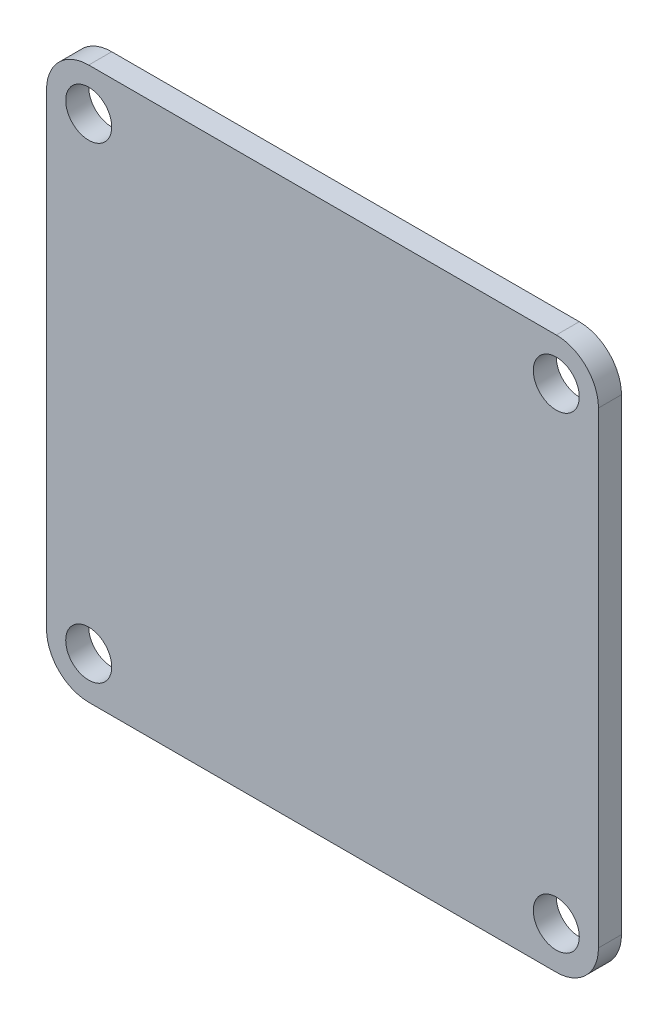
ISO-10303-21;
HEADER;
FILE_DESCRIPTION(('STEP AP214'),'2;1');
FILE_NAME('part.step','',(''),(''),'','','');
FILE_SCHEMA(('AUTOMOTIVE_DESIGN { 1 0 10303 214 1 1 1 1 }'));
ENDSEC;
DATA;
#1=APPLICATION_CONTEXT('core data for automotive mechanical design processes');
#2=APPLICATION_PROTOCOL_DEFINITION('international standard','automotive_design',2000,#1);
#3=PRODUCT_CONTEXT('',#1,'mechanical');
#4=PRODUCT('Part','Part','',(#3));
#5=PRODUCT_RELATED_PRODUCT_CATEGORY('part','',(#4));
#6=PRODUCT_DEFINITION_FORMATION('','',#4);
#7=PRODUCT_DEFINITION_CONTEXT('part definition',#1,'design');
#8=PRODUCT_DEFINITION('design','',#6,#7);
#9=PRODUCT_DEFINITION_SHAPE('','',#8);
#10=(LENGTH_UNIT() NAMED_UNIT(*) SI_UNIT(.MILLI.,.METRE.));
#11=(NAMED_UNIT(*) PLANE_ANGLE_UNIT() SI_UNIT($,.RADIAN.));
#12=(NAMED_UNIT(*) SI_UNIT($,.STERADIAN.) SOLID_ANGLE_UNIT());
#13=UNCERTAINTY_MEASURE_WITH_UNIT(LENGTH_MEASURE(1.E-05),#10,'distance_accuracy_value','');
#14=(GEOMETRIC_REPRESENTATION_CONTEXT(3) GLOBAL_UNCERTAINTY_ASSIGNED_CONTEXT((#13)) GLOBAL_UNIT_ASSIGNED_CONTEXT((#10,
#11,#12)) REPRESENTATION_CONTEXT('',''));
#15=CARTESIAN_POINT('',(0.,0.,0.));
#16=DIRECTION('',(0.,0.,1.));
#17=DIRECTION('',(1.,0.,0.));
#18=AXIS2_PLACEMENT_3D('',#15,#16,#17);
#19=CARTESIAN_POINT('',(-15.25,-15.25,1.5));
#20=DIRECTION('',(0.,0.,-1.));
#21=DIRECTION('',(-1.,0.,0.));
#22=AXIS2_PLACEMENT_3D('',#19,#20,#21);
#23=PLANE('',#22);
#24=CARTESIAN_POINT('',(-15.25,-15.25,1.5));
#25=DIRECTION('',(0.,0.,1.));
#26=DIRECTION('',(-1.,0.,0.));
#27=AXIS2_PLACEMENT_3D('',#24,#25,#26);
#28=CIRCLE('',#27,2.75);
#29=CARTESIAN_POINT('',(-18.,-15.25,1.5));
#30=VERTEX_POINT('',#29);
#31=CARTESIAN_POINT('',(-15.25,-18.,1.5));
#32=VERTEX_POINT('',#31);
#33=EDGE_CURVE('E151',#30,#32,#28,.T.);
#34=ORIENTED_EDGE('',*,*,#33,.T.);
#35=DIRECTION('',(1.,0.,0.));
#36=VECTOR('',#35,1.);
#37=CARTESIAN_POINT('',(-15.25,-18.,1.5));
#38=LINE('',#37,#36);
#39=CARTESIAN_POINT('',(15.25,-18.,1.5));
#40=VERTEX_POINT('',#39);
#41=EDGE_CURVE('E99',#32,#40,#38,.T.);
#42=ORIENTED_EDGE('',*,*,#41,.T.);
#43=CARTESIAN_POINT('',(15.25,-15.25,1.5));
#44=DIRECTION('',(0.,0.,1.));
#45=DIRECTION('',(1.,0.,0.));
#46=AXIS2_PLACEMENT_3D('',#43,#44,#45);
#47=CIRCLE('',#46,2.75);
#48=CARTESIAN_POINT('',(18.,-15.25,1.5));
#49=VERTEX_POINT('',#48);
#50=EDGE_CURVE('E166',#40,#49,#47,.T.);
#51=ORIENTED_EDGE('',*,*,#50,.T.);
#52=DIRECTION('',(0.,1.,0.));
#53=VECTOR('',#52,1.);
#54=CARTESIAN_POINT('',(18.,15.25,1.5));
#55=LINE('',#54,#53);
#56=CARTESIAN_POINT('',(18.,15.25,1.5));
#57=VERTEX_POINT('',#56);
#58=EDGE_CURVE('E179',#49,#57,#55,.T.);
#59=ORIENTED_EDGE('',*,*,#58,.T.);
#60=CARTESIAN_POINT('',(15.25,15.25,1.5));
#61=DIRECTION('',(0.,0.,1.));
#62=DIRECTION('',(1.,0.,0.));
#63=AXIS2_PLACEMENT_3D('',#60,#61,#62);
#64=CIRCLE('',#63,2.75);
#65=CARTESIAN_POINT('',(15.25,18.,1.5));
#66=VERTEX_POINT('',#65);
#67=EDGE_CURVE('E118',#57,#66,#64,.T.);
#68=ORIENTED_EDGE('',*,*,#67,.T.);
#69=DIRECTION('',(-1.,0.,0.));
#70=VECTOR('',#69,1.);
#71=CARTESIAN_POINT('',(-15.25,18.,1.5));
#72=LINE('',#71,#70);
#73=CARTESIAN_POINT('',(-15.25,18.,1.5));
#74=VERTEX_POINT('',#73);
#75=EDGE_CURVE('E112',#66,#74,#72,.T.);
#76=ORIENTED_EDGE('',*,*,#75,.T.);
#77=CARTESIAN_POINT('',(-15.25,15.25,1.5));
#78=DIRECTION('',(0.,0.,1.));
#79=DIRECTION('',(-1.,0.,0.));
#80=AXIS2_PLACEMENT_3D('',#77,#78,#79);
#81=CIRCLE('',#80,2.75);
#82=CARTESIAN_POINT('',(-18.,15.25,1.5));
#83=VERTEX_POINT('',#82);
#84=EDGE_CURVE('E116',#74,#83,#81,.T.);
#85=ORIENTED_EDGE('',*,*,#84,.T.);
#86=DIRECTION('',(0.,-1.,0.));
#87=VECTOR('',#86,1.);
#88=CARTESIAN_POINT('',(-18.,15.25,1.5));
#89=LINE('',#88,#87);
#90=EDGE_CURVE('E56',#83,#30,#89,.T.);
#91=ORIENTED_EDGE('',*,*,#90,.T.);
#92=EDGE_LOOP('',(#34,#42,#51,#59,#68,#76,#85,#91));
#93=FACE_BOUND('',#92,.T.);
#94=CARTESIAN_POINT('',(-15.25,15.25,1.5));
#95=DIRECTION('',(0.,0.,1.));
#96=DIRECTION('',(1.,0.,0.));
#97=AXIS2_PLACEMENT_3D('',#94,#95,#96);
#98=CIRCLE('',#97,1.5);
#99=CARTESIAN_POINT('',(-13.75,15.25,1.5));
#100=VERTEX_POINT('',#99);
#101=EDGE_CURVE('E140',#100,#100,#98,.T.);
#102=ORIENTED_EDGE('',*,*,#101,.F.);
#103=EDGE_LOOP('',(#102));
#104=FACE_BOUND('',#103,.T.);
#105=CARTESIAN_POINT('',(15.25,15.25,1.5));
#106=DIRECTION('',(0.,0.,1.));
#107=DIRECTION('',(-1.,0.,0.));
#108=AXIS2_PLACEMENT_3D('',#105,#106,#107);
#109=CIRCLE('',#108,1.5);
#110=CARTESIAN_POINT('',(13.75,15.25,1.5));
#111=VERTEX_POINT('',#110);
#112=EDGE_CURVE('E188',#111,#111,#109,.T.);
#113=ORIENTED_EDGE('',*,*,#112,.F.);
#114=EDGE_LOOP('',(#113));
#115=FACE_BOUND('',#114,.T.);
#116=CARTESIAN_POINT('',(15.25,-15.25,1.5));
#117=DIRECTION('',(0.,0.,1.));
#118=DIRECTION('',(1.,0.,0.));
#119=AXIS2_PLACEMENT_3D('',#116,#117,#118);
#120=CIRCLE('',#119,1.5);
#121=CARTESIAN_POINT('',(16.75,-15.25,1.5));
#122=VERTEX_POINT('',#121);
#123=EDGE_CURVE('E194',#122,#122,#120,.T.);
#124=ORIENTED_EDGE('',*,*,#123,.F.);
#125=EDGE_LOOP('',(#124));
#126=FACE_BOUND('',#125,.T.);
#127=CARTESIAN_POINT('',(-15.25,-15.25,1.5));
#128=DIRECTION('',(0.,0.,1.));
#129=DIRECTION('',(-1.,0.,0.));
#130=AXIS2_PLACEMENT_3D('',#127,#128,#129);
#131=CIRCLE('',#130,1.5);
#132=CARTESIAN_POINT('',(-16.75,-15.25,1.5));
#133=VERTEX_POINT('',#132);
#134=EDGE_CURVE('E200',#133,#133,#131,.T.);
#135=ORIENTED_EDGE('',*,*,#134,.F.);
#136=EDGE_LOOP('',(#135));
#137=FACE_BOUND('',#136,.T.);
#138=ADVANCED_FACE('F39',(#93,#104,#115,#126,#137),#23,.F.);
#139=CARTESIAN_POINT('',(-15.25,-15.25,0.));
#140=DIRECTION('',(0.,0.,-1.));
#141=DIRECTION('',(-1.,0.,0.));
#142=AXIS2_PLACEMENT_3D('',#139,#140,#141);
#143=PLANE('',#142);
#144=CARTESIAN_POINT('',(15.25,-15.25,0.));
#145=DIRECTION('',(0.,0.,1.));
#146=DIRECTION('',(1.,0.,0.));
#147=AXIS2_PLACEMENT_3D('',#144,#145,#146);
#148=CIRCLE('',#147,1.5);
#149=CARTESIAN_POINT('',(16.75,-15.25,0.));
#150=VERTEX_POINT('',#149);
#151=EDGE_CURVE('E197',#150,#150,#148,.T.);
#152=ORIENTED_EDGE('',*,*,#151,.T.);
#153=EDGE_LOOP('',(#152));
#154=FACE_BOUND('',#153,.T.);
#155=CARTESIAN_POINT('',(-15.25,15.25,0.));
#156=DIRECTION('',(0.,0.,1.));
#157=DIRECTION('',(1.,0.,0.));
#158=AXIS2_PLACEMENT_3D('',#155,#156,#157);
#159=CIRCLE('',#158,1.5);
#160=CARTESIAN_POINT('',(-13.75,15.25,0.));
#161=VERTEX_POINT('',#160);
#162=EDGE_CURVE('E185',#161,#161,#159,.T.);
#163=ORIENTED_EDGE('',*,*,#162,.T.);
#164=EDGE_LOOP('',(#163));
#165=FACE_BOUND('',#164,.T.);
#166=CARTESIAN_POINT('',(-15.25,-15.25,0.));
#167=DIRECTION('',(0.,0.,1.));
#168=DIRECTION('',(-1.,0.,0.));
#169=AXIS2_PLACEMENT_3D('',#166,#167,#168);
#170=CIRCLE('',#169,2.75);
#171=CARTESIAN_POINT('',(-18.,-15.25,0.));
#172=VERTEX_POINT('',#171);
#173=CARTESIAN_POINT('',(-15.25,-18.,0.));
#174=VERTEX_POINT('',#173);
#175=EDGE_CURVE('E136',#172,#174,#170,.T.);
#176=ORIENTED_EDGE('',*,*,#175,.F.);
#177=DIRECTION('',(0.,-1.,0.));
#178=VECTOR('',#177,1.);
#179=CARTESIAN_POINT('',(-18.,15.25,0.));
#180=LINE('',#179,#178);
#181=CARTESIAN_POINT('',(-18.,15.25,0.));
#182=VERTEX_POINT('',#181);
#183=EDGE_CURVE('E91',#182,#172,#180,.T.);
#184=ORIENTED_EDGE('',*,*,#183,.F.);
#185=CARTESIAN_POINT('',(-15.25,15.25,0.));
#186=DIRECTION('',(0.,0.,1.));
#187=DIRECTION('',(-1.,0.,0.));
#188=AXIS2_PLACEMENT_3D('',#185,#186,#187);
#189=CIRCLE('',#188,2.75);
#190=CARTESIAN_POINT('',(-15.25,18.,0.));
#191=VERTEX_POINT('',#190);
#192=EDGE_CURVE('E85',#191,#182,#189,.T.);
#193=ORIENTED_EDGE('',*,*,#192,.F.);
#194=DIRECTION('',(-1.,0.,0.));
#195=VECTOR('',#194,1.);
#196=CARTESIAN_POINT('',(-15.25,18.,0.));
#197=LINE('',#196,#195);
#198=CARTESIAN_POINT('',(15.25,18.,0.));
#199=VERTEX_POINT('',#198);
#200=EDGE_CURVE('E126',#199,#191,#197,.T.);
#201=ORIENTED_EDGE('',*,*,#200,.F.);
#202=CARTESIAN_POINT('',(15.25,15.25,0.));
#203=DIRECTION('',(0.,0.,1.));
#204=DIRECTION('',(1.,0.,0.));
#205=AXIS2_PLACEMENT_3D('',#202,#203,#204);
#206=CIRCLE('',#205,2.75);
#207=CARTESIAN_POINT('',(18.,15.25,0.));
#208=VERTEX_POINT('',#207);
#209=EDGE_CURVE('E146',#208,#199,#206,.T.);
#210=ORIENTED_EDGE('',*,*,#209,.F.);
#211=DIRECTION('',(0.,1.,0.));
#212=VECTOR('',#211,1.);
#213=CARTESIAN_POINT('',(18.,15.25,0.));
#214=LINE('',#213,#212);
#215=CARTESIAN_POINT('',(18.,-15.25,0.));
#216=VERTEX_POINT('',#215);
#217=EDGE_CURVE('E144',#216,#208,#214,.T.);
#218=ORIENTED_EDGE('',*,*,#217,.F.);
#219=CARTESIAN_POINT('',(15.25,-15.25,0.));
#220=DIRECTION('',(0.,0.,1.));
#221=DIRECTION('',(1.,0.,0.));
#222=AXIS2_PLACEMENT_3D('',#219,#220,#221);
#223=CIRCLE('',#222,2.75);
#224=CARTESIAN_POINT('',(15.25,-18.,0.));
#225=VERTEX_POINT('',#224);
#226=EDGE_CURVE('E142',#225,#216,#223,.T.);
#227=ORIENTED_EDGE('',*,*,#226,.F.);
#228=DIRECTION('',(1.,0.,0.));
#229=VECTOR('',#228,1.);
#230=CARTESIAN_POINT('',(-15.25,-18.,0.));
#231=LINE('',#230,#229);
#232=EDGE_CURVE('E139',#174,#225,#231,.T.);
#233=ORIENTED_EDGE('',*,*,#232,.F.);
#234=EDGE_LOOP('',(#176,#184,#193,#201,#210,#218,#227,#233));
#235=FACE_BOUND('',#234,.T.);
#236=CARTESIAN_POINT('',(15.25,15.25,0.));
#237=DIRECTION('',(0.,0.,1.));
#238=DIRECTION('',(-1.,0.,0.));
#239=AXIS2_PLACEMENT_3D('',#236,#237,#238);
#240=CIRCLE('',#239,1.5);
#241=CARTESIAN_POINT('',(13.75,15.25,0.));
#242=VERTEX_POINT('',#241);
#243=EDGE_CURVE('E191',#242,#242,#240,.T.);
#244=ORIENTED_EDGE('',*,*,#243,.T.);
#245=EDGE_LOOP('',(#244));
#246=FACE_BOUND('',#245,.T.);
#247=CARTESIAN_POINT('',(-15.25,-15.25,0.));
#248=DIRECTION('',(0.,0.,1.));
#249=DIRECTION('',(-1.,0.,0.));
#250=AXIS2_PLACEMENT_3D('',#247,#248,#249);
#251=CIRCLE('',#250,1.5);
#252=CARTESIAN_POINT('',(-16.75,-15.25,0.));
#253=VERTEX_POINT('',#252);
#254=EDGE_CURVE('E203',#253,#253,#251,.T.);
#255=ORIENTED_EDGE('',*,*,#254,.T.);
#256=EDGE_LOOP('',(#255));
#257=FACE_BOUND('',#256,.T.);
#258=ADVANCED_FACE('F170',(#154,#165,#235,#246,#257),#143,.T.);
#259=CARTESIAN_POINT('',(-15.25,-15.25,1.5));
#260=DIRECTION('',(0.,0.,-1.));
#261=DIRECTION('',(-1.,0.,0.));
#262=AXIS2_PLACEMENT_3D('',#259,#260,#261);
#263=CYLINDRICAL_SURFACE('',#262,2.75);
#264=ORIENTED_EDGE('',*,*,#175,.T.);
#265=DIRECTION('',(0.,0.,-1.));
#266=VECTOR('',#265,1.);
#267=CARTESIAN_POINT('',(-15.25,-18.,1.5));
#268=LINE('',#267,#266);
#269=EDGE_CURVE('E11',#32,#174,#268,.T.);
#270=ORIENTED_EDGE('',*,*,#269,.F.);
#271=ORIENTED_EDGE('',*,*,#33,.F.);
#272=DIRECTION('',(0.,0.,-1.));
#273=VECTOR('',#272,1.);
#274=CARTESIAN_POINT('',(-18.,-15.25,1.5));
#275=LINE('',#274,#273);
#276=EDGE_CURVE('E132',#30,#172,#275,.T.);
#277=ORIENTED_EDGE('',*,*,#276,.T.);
#278=EDGE_LOOP('',(#264,#270,#271,#277));
#279=FACE_BOUND('',#278,.T.);
#280=ADVANCED_FACE('F41',(#279),#263,.T.);
#281=CARTESIAN_POINT('',(-15.25,-18.,1.5));
#282=DIRECTION('',(0.,1.,0.));
#283=DIRECTION('',(-1.,0.,0.));
#284=AXIS2_PLACEMENT_3D('',#281,#282,#283);
#285=PLANE('',#284);
#286=ORIENTED_EDGE('',*,*,#232,.T.);
#287=DIRECTION('',(0.,0.,-1.));
#288=VECTOR('',#287,1.);
#289=CARTESIAN_POINT('',(15.25,-18.,1.5));
#290=LINE('',#289,#288);
#291=EDGE_CURVE('E48',#40,#225,#290,.T.);
#292=ORIENTED_EDGE('',*,*,#291,.F.);
#293=ORIENTED_EDGE('',*,*,#41,.F.);
#294=ORIENTED_EDGE('',*,*,#269,.T.);
#295=EDGE_LOOP('',(#286,#292,#293,#294));
#296=FACE_BOUND('',#295,.T.);
#297=ADVANCED_FACE('F235',(#296),#285,.F.);
#298=CARTESIAN_POINT('',(15.25,-15.25,1.5));
#299=DIRECTION('',(0.,0.,-1.));
#300=DIRECTION('',(-1.,0.,0.));
#301=AXIS2_PLACEMENT_3D('',#298,#299,#300);
#302=CYLINDRICAL_SURFACE('',#301,2.75);
#303=ORIENTED_EDGE('',*,*,#226,.T.);
#304=DIRECTION('',(0.,0.,-1.));
#305=VECTOR('',#304,1.);
#306=CARTESIAN_POINT('',(18.,-15.25,1.5));
#307=LINE('',#306,#305);
#308=EDGE_CURVE('E158',#49,#216,#307,.T.);
#309=ORIENTED_EDGE('',*,*,#308,.F.);
#310=ORIENTED_EDGE('',*,*,#50,.F.);
#311=ORIENTED_EDGE('',*,*,#291,.T.);
#312=EDGE_LOOP('',(#303,#309,#310,#311));
#313=FACE_BOUND('',#312,.T.);
#314=ADVANCED_FACE('F164',(#313),#302,.T.);
#315=CARTESIAN_POINT('',(18.,15.25,1.5));
#316=DIRECTION('',(-1.,0.,0.));
#317=DIRECTION('',(0.,0.,1.));
#318=AXIS2_PLACEMENT_3D('',#315,#316,#317);
#319=PLANE('',#318);
#320=ORIENTED_EDGE('',*,*,#217,.T.);
#321=DIRECTION('',(0.,0.,-1.));
#322=VECTOR('',#321,1.);
#323=CARTESIAN_POINT('',(18.,15.25,1.5));
#324=LINE('',#323,#322);
#325=EDGE_CURVE('E155',#57,#208,#324,.T.);
#326=ORIENTED_EDGE('',*,*,#325,.F.);
#327=ORIENTED_EDGE('',*,*,#58,.F.);
#328=ORIENTED_EDGE('',*,*,#308,.T.);
#329=EDGE_LOOP('',(#320,#326,#327,#328));
#330=FACE_BOUND('',#329,.T.);
#331=ADVANCED_FACE('F175',(#330),#319,.F.);
#332=CARTESIAN_POINT('',(15.25,15.25,1.5));
#333=DIRECTION('',(0.,0.,-1.));
#334=DIRECTION('',(-1.,0.,0.));
#335=AXIS2_PLACEMENT_3D('',#332,#333,#334);
#336=CYLINDRICAL_SURFACE('',#335,2.75);
#337=ORIENTED_EDGE('',*,*,#209,.T.);
#338=DIRECTION('',(0.,0.,-1.));
#339=VECTOR('',#338,1.);
#340=CARTESIAN_POINT('',(15.25,18.,1.5));
#341=LINE('',#340,#339);
#342=EDGE_CURVE('E127',#66,#199,#341,.T.);
#343=ORIENTED_EDGE('',*,*,#342,.F.);
#344=ORIENTED_EDGE('',*,*,#67,.F.);
#345=ORIENTED_EDGE('',*,*,#325,.T.);
#346=EDGE_LOOP('',(#337,#343,#344,#345));
#347=FACE_BOUND('',#346,.T.);
#348=ADVANCED_FACE('F178',(#347),#336,.T.);
#349=CARTESIAN_POINT('',(-15.25,18.,1.5));
#350=DIRECTION('',(0.,-1.,0.));
#351=DIRECTION('',(1.,0.,0.));
#352=AXIS2_PLACEMENT_3D('',#349,#350,#351);
#353=PLANE('',#352);
#354=ORIENTED_EDGE('',*,*,#200,.T.);
#355=DIRECTION('',(0.,0.,-1.));
#356=VECTOR('',#355,1.);
#357=CARTESIAN_POINT('',(-15.25,18.,1.5));
#358=LINE('',#357,#356);
#359=EDGE_CURVE('E123',#74,#191,#358,.T.);
#360=ORIENTED_EDGE('',*,*,#359,.F.);
#361=ORIENTED_EDGE('',*,*,#75,.F.);
#362=ORIENTED_EDGE('',*,*,#342,.T.);
#363=EDGE_LOOP('',(#354,#360,#361,#362));
#364=FACE_BOUND('',#363,.T.);
#365=ADVANCED_FACE('F124',(#364),#353,.F.);
#366=CARTESIAN_POINT('',(-15.25,15.25,1.5));
#367=DIRECTION('',(0.,0.,-1.));
#368=DIRECTION('',(-1.,0.,0.));
#369=AXIS2_PLACEMENT_3D('',#366,#367,#368);
#370=CYLINDRICAL_SURFACE('',#369,2.75);
#371=ORIENTED_EDGE('',*,*,#192,.T.);
#372=DIRECTION('',(0.,0.,-1.));
#373=VECTOR('',#372,1.);
#374=CARTESIAN_POINT('',(-18.,15.25,1.5));
#375=LINE('',#374,#373);
#376=EDGE_CURVE('E128',#83,#182,#375,.T.);
#377=ORIENTED_EDGE('',*,*,#376,.F.);
#378=ORIENTED_EDGE('',*,*,#84,.F.);
#379=ORIENTED_EDGE('',*,*,#359,.T.);
#380=EDGE_LOOP('',(#371,#377,#378,#379));
#381=FACE_BOUND('',#380,.T.);
#382=ADVANCED_FACE('F130',(#381),#370,.T.);
#383=CARTESIAN_POINT('',(-18.,15.25,1.5));
#384=DIRECTION('',(1.,0.,0.));
#385=DIRECTION('',(0.,1.,0.));
#386=AXIS2_PLACEMENT_3D('',#383,#384,#385);
#387=PLANE('',#386);
#388=ORIENTED_EDGE('',*,*,#183,.T.);
#389=ORIENTED_EDGE('',*,*,#276,.F.);
#390=ORIENTED_EDGE('',*,*,#90,.F.);
#391=ORIENTED_EDGE('',*,*,#376,.T.);
#392=EDGE_LOOP('',(#388,#389,#390,#391));
#393=FACE_BOUND('',#392,.T.);
#394=ADVANCED_FACE('F223',(#393),#387,.F.);
#395=CARTESIAN_POINT('',(-15.25,15.25,1.5));
#396=DIRECTION('',(0.,0.,-1.));
#397=DIRECTION('',(-1.,0.,0.));
#398=AXIS2_PLACEMENT_3D('',#395,#396,#397);
#399=CYLINDRICAL_SURFACE('',#398,1.5);
#400=ORIENTED_EDGE('',*,*,#101,.T.);
#401=EDGE_LOOP('',(#400));
#402=FACE_BOUND('',#401,.T.);
#403=ORIENTED_EDGE('',*,*,#162,.F.);
#404=EDGE_LOOP('',(#403));
#405=FACE_BOUND('',#404,.T.);
#406=ADVANCED_FACE('F220',(#402,#405),#399,.F.);
#407=CARTESIAN_POINT('',(15.25,15.25,1.5));
#408=DIRECTION('',(0.,0.,-1.));
#409=DIRECTION('',(-1.,0.,0.));
#410=AXIS2_PLACEMENT_3D('',#407,#408,#409);
#411=CYLINDRICAL_SURFACE('',#410,1.5);
#412=ORIENTED_EDGE('',*,*,#112,.T.);
#413=EDGE_LOOP('',(#412));
#414=FACE_BOUND('',#413,.T.);
#415=ORIENTED_EDGE('',*,*,#243,.F.);
#416=EDGE_LOOP('',(#415));
#417=FACE_BOUND('',#416,.T.);
#418=ADVANCED_FACE('F301',(#414,#417),#411,.F.);
#419=CARTESIAN_POINT('',(15.25,-15.25,1.5));
#420=DIRECTION('',(0.,0.,-1.));
#421=DIRECTION('',(-1.,0.,0.));
#422=AXIS2_PLACEMENT_3D('',#419,#420,#421);
#423=CYLINDRICAL_SURFACE('',#422,1.5);
#424=ORIENTED_EDGE('',*,*,#123,.T.);
#425=EDGE_LOOP('',(#424));
#426=FACE_BOUND('',#425,.T.);
#427=ORIENTED_EDGE('',*,*,#151,.F.);
#428=EDGE_LOOP('',(#427));
#429=FACE_BOUND('',#428,.T.);
#430=ADVANCED_FACE('F309',(#426,#429),#423,.F.);
#431=CARTESIAN_POINT('',(-15.25,-15.25,1.5));
#432=DIRECTION('',(0.,0.,-1.));
#433=DIRECTION('',(-1.,0.,0.));
#434=AXIS2_PLACEMENT_3D('',#431,#432,#433);
#435=CYLINDRICAL_SURFACE('',#434,1.5);
#436=ORIENTED_EDGE('',*,*,#134,.T.);
#437=EDGE_LOOP('',(#436));
#438=FACE_BOUND('',#437,.T.);
#439=ORIENTED_EDGE('',*,*,#254,.F.);
#440=EDGE_LOOP('',(#439));
#441=FACE_BOUND('',#440,.T.);
#442=ADVANCED_FACE('F209',(#438,#441),#435,.F.);
#443=CLOSED_SHELL('',(#138,#258,#280,#297,#314,#331,#348,#365,#382,#394,#406,#418,#430,#442));
#444=MANIFOLD_SOLID_BREP('B2',#443);
#445=ADVANCED_BREP_SHAPE_REPRESENTATION('',(#18,#444),#14);
#446=SHAPE_DEFINITION_REPRESENTATION(#9,#445);
ENDSEC;
END-ISO-10303-21;
